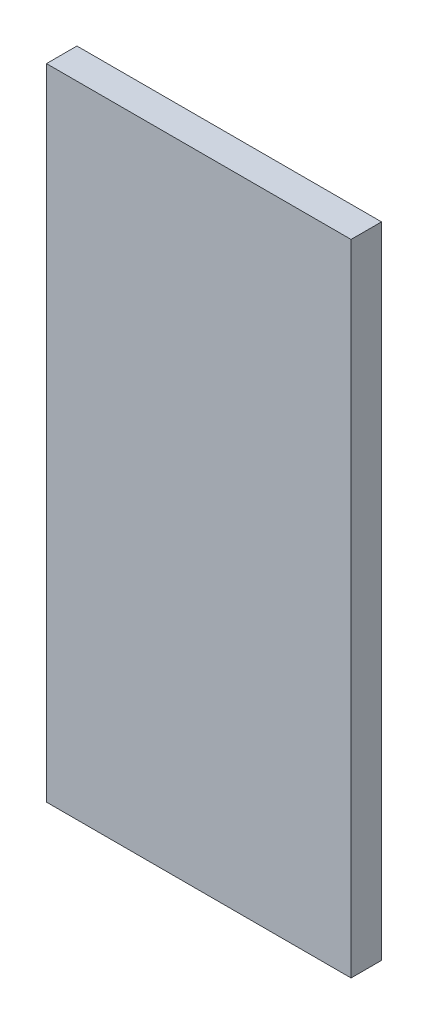
ISO-10303-21;
HEADER;
FILE_DESCRIPTION(('STEP AP214'),'2;1');
FILE_NAME('part.step','',(''),(''),'','','');
FILE_SCHEMA(('AUTOMOTIVE_DESIGN { 1 0 10303 214 1 1 1 1 }'));
ENDSEC;
DATA;
#1=APPLICATION_CONTEXT('core data for automotive mechanical design processes');
#2=APPLICATION_PROTOCOL_DEFINITION('international standard','automotive_design',2000,#1);
#3=PRODUCT_CONTEXT('',#1,'mechanical');
#4=PRODUCT('Part','Part','',(#3));
#5=PRODUCT_RELATED_PRODUCT_CATEGORY('part','',(#4));
#6=PRODUCT_DEFINITION_FORMATION('','',#4);
#7=PRODUCT_DEFINITION_CONTEXT('part definition',#1,'design');
#8=PRODUCT_DEFINITION('design','',#6,#7);
#9=PRODUCT_DEFINITION_SHAPE('','',#8);
#10=(LENGTH_UNIT() NAMED_UNIT(*) SI_UNIT(.MILLI.,.METRE.));
#11=(NAMED_UNIT(*) PLANE_ANGLE_UNIT() SI_UNIT($,.RADIAN.));
#12=(NAMED_UNIT(*) SI_UNIT($,.STERADIAN.) SOLID_ANGLE_UNIT());
#13=UNCERTAINTY_MEASURE_WITH_UNIT(LENGTH_MEASURE(1.E-05),#10,'distance_accuracy_value','');
#14=(GEOMETRIC_REPRESENTATION_CONTEXT(3) GLOBAL_UNCERTAINTY_ASSIGNED_CONTEXT((#13)) GLOBAL_UNIT_ASSIGNED_CONTEXT((#10,
#11,#12)) REPRESENTATION_CONTEXT('',''));
#15=CARTESIAN_POINT('',(0.,0.,0.));
#16=DIRECTION('',(0.,0.,1.));
#17=DIRECTION('',(1.,0.,0.));
#18=AXIS2_PLACEMENT_3D('',#15,#16,#17);
#19=CARTESIAN_POINT('',(0.,0.,10.));
#20=DIRECTION('',(1.,0.,0.));
#21=DIRECTION('',(0.,0.,-1.));
#22=AXIS2_PLACEMENT_3D('',#19,#20,#21);
#23=PLANE('',#22);
#24=DIRECTION('',(0.,-1.,0.));
#25=VECTOR('',#24,1.);
#26=CARTESIAN_POINT('',(0.,0.,0.));
#27=LINE('',#26,#25);
#28=CARTESIAN_POINT('',(0.,210.,0.));
#29=VERTEX_POINT('',#28);
#30=CARTESIAN_POINT('',(0.,0.,0.));
#31=VERTEX_POINT('',#30);
#32=EDGE_CURVE('E99',#29,#31,#27,.T.);
#33=ORIENTED_EDGE('',*,*,#32,.T.);
#34=DIRECTION('',(0.,0.,-1.));
#35=VECTOR('',#34,1.);
#36=CARTESIAN_POINT('',(0.,0.,10.));
#37=LINE('',#36,#35);
#38=CARTESIAN_POINT('',(0.,0.,10.));
#39=VERTEX_POINT('',#38);
#40=EDGE_CURVE('E11',#39,#31,#37,.T.);
#41=ORIENTED_EDGE('',*,*,#40,.F.);
#42=DIRECTION('',(0.,-1.,0.));
#43=VECTOR('',#42,1.);
#44=CARTESIAN_POINT('',(0.,0.,10.));
#45=LINE('',#44,#43);
#46=CARTESIAN_POINT('',(0.,210.,10.));
#47=VERTEX_POINT('',#46);
#48=EDGE_CURVE('E87',#47,#39,#45,.T.);
#49=ORIENTED_EDGE('',*,*,#48,.F.);
#50=DIRECTION('',(0.,0.,-1.));
#51=VECTOR('',#50,1.);
#52=CARTESIAN_POINT('',(0.,210.,10.));
#53=LINE('',#52,#51);
#54=EDGE_CURVE('E95',#47,#29,#53,.T.);
#55=ORIENTED_EDGE('',*,*,#54,.T.);
#56=EDGE_LOOP('',(#33,#41,#49,#55));
#57=FACE_BOUND('',#56,.T.);
#58=ADVANCED_FACE('F36',(#57),#23,.F.);
#59=CARTESIAN_POINT('',(0.,0.,10.));
#60=DIRECTION('',(0.,1.,0.));
#61=DIRECTION('',(0.,0.,1.));
#62=AXIS2_PLACEMENT_3D('',#59,#60,#61);
#63=PLANE('',#62);
#64=DIRECTION('',(1.,0.,0.));
#65=VECTOR('',#64,1.);
#66=CARTESIAN_POINT('',(0.,0.,0.));
#67=LINE('',#66,#65);
#68=CARTESIAN_POINT('',(100.,0.,0.));
#69=VERTEX_POINT('',#68);
#70=EDGE_CURVE('E91',#31,#69,#67,.T.);
#71=ORIENTED_EDGE('',*,*,#70,.T.);
#72=DIRECTION('',(0.,0.,-1.));
#73=VECTOR('',#72,1.);
#74=CARTESIAN_POINT('',(100.,0.,10.));
#75=LINE('',#74,#73);
#76=CARTESIAN_POINT('',(100.,0.,10.));
#77=VERTEX_POINT('',#76);
#78=EDGE_CURVE('E44',#77,#69,#75,.T.);
#79=ORIENTED_EDGE('',*,*,#78,.F.);
#80=DIRECTION('',(1.,0.,0.));
#81=VECTOR('',#80,1.);
#82=CARTESIAN_POINT('',(0.,0.,10.));
#83=LINE('',#82,#81);
#84=EDGE_CURVE('E82',#39,#77,#83,.T.);
#85=ORIENTED_EDGE('',*,*,#84,.F.);
#86=ORIENTED_EDGE('',*,*,#40,.T.);
#87=EDGE_LOOP('',(#71,#79,#85,#86));
#88=FACE_BOUND('',#87,.T.);
#89=ADVANCED_FACE('F90',(#88),#63,.F.);
#90=CARTESIAN_POINT('',(100.,0.,10.));
#91=DIRECTION('',(-1.,0.,0.));
#92=DIRECTION('',(0.,0.,1.));
#93=AXIS2_PLACEMENT_3D('',#90,#91,#92);
#94=PLANE('',#93);
#95=DIRECTION('',(0.,1.,0.));
#96=VECTOR('',#95,1.);
#97=CARTESIAN_POINT('',(100.,0.,0.));
#98=LINE('',#97,#96);
#99=CARTESIAN_POINT('',(100.,210.,0.));
#100=VERTEX_POINT('',#99);
#101=EDGE_CURVE('E69',#69,#100,#98,.T.);
#102=ORIENTED_EDGE('',*,*,#101,.T.);
#103=DIRECTION('',(0.,0.,-1.));
#104=VECTOR('',#103,1.);
#105=CARTESIAN_POINT('',(100.,210.,10.));
#106=LINE('',#105,#104);
#107=CARTESIAN_POINT('',(100.,210.,10.));
#108=VERTEX_POINT('',#107);
#109=EDGE_CURVE('E92',#108,#100,#106,.T.);
#110=ORIENTED_EDGE('',*,*,#109,.F.);
#111=DIRECTION('',(0.,1.,0.));
#112=VECTOR('',#111,1.);
#113=CARTESIAN_POINT('',(100.,0.,10.));
#114=LINE('',#113,#112);
#115=EDGE_CURVE('E85',#77,#108,#114,.T.);
#116=ORIENTED_EDGE('',*,*,#115,.F.);
#117=ORIENTED_EDGE('',*,*,#78,.T.);
#118=EDGE_LOOP('',(#102,#110,#116,#117));
#119=FACE_BOUND('',#118,.T.);
#120=ADVANCED_FACE('F93',(#119),#94,.F.);
#121=CARTESIAN_POINT('',(0.,210.,10.));
#122=DIRECTION('',(0.,-1.,0.));
#123=DIRECTION('',(0.,0.,-1.));
#124=AXIS2_PLACEMENT_3D('',#121,#122,#123);
#125=PLANE('',#124);
#126=DIRECTION('',(-1.,0.,0.));
#127=VECTOR('',#126,1.);
#128=CARTESIAN_POINT('',(0.,210.,0.));
#129=LINE('',#128,#127);
#130=EDGE_CURVE('E75',#100,#29,#129,.T.);
#131=ORIENTED_EDGE('',*,*,#130,.T.);
#132=ORIENTED_EDGE('',*,*,#54,.F.);
#133=DIRECTION('',(-1.,0.,0.));
#134=VECTOR('',#133,1.);
#135=CARTESIAN_POINT('',(0.,210.,10.));
#136=LINE('',#135,#134);
#137=EDGE_CURVE('E52',#108,#47,#136,.T.);
#138=ORIENTED_EDGE('',*,*,#137,.F.);
#139=ORIENTED_EDGE('',*,*,#109,.T.);
#140=EDGE_LOOP('',(#131,#132,#138,#139));
#141=FACE_BOUND('',#140,.T.);
#142=ADVANCED_FACE('F106',(#141),#125,.F.);
#143=CARTESIAN_POINT('',(0.,0.,10.));
#144=DIRECTION('',(0.,0.,-1.));
#145=DIRECTION('',(-1.,0.,0.));
#146=AXIS2_PLACEMENT_3D('',#143,#144,#145);
#147=PLANE('',#146);
#148=ORIENTED_EDGE('',*,*,#48,.T.);
#149=ORIENTED_EDGE('',*,*,#84,.T.);
#150=ORIENTED_EDGE('',*,*,#115,.T.);
#151=ORIENTED_EDGE('',*,*,#137,.T.);
#152=EDGE_LOOP('',(#148,#149,#150,#151));
#153=FACE_BOUND('',#152,.T.);
#154=ADVANCED_FACE('F83',(#153),#147,.F.);
#155=CARTESIAN_POINT('',(0.,0.,0.));
#156=DIRECTION('',(0.,0.,-1.));
#157=DIRECTION('',(-1.,0.,0.));
#158=AXIS2_PLACEMENT_3D('',#155,#156,#157);
#159=PLANE('',#158);
#160=ORIENTED_EDGE('',*,*,#32,.F.);
#161=ORIENTED_EDGE('',*,*,#130,.F.);
#162=ORIENTED_EDGE('',*,*,#101,.F.);
#163=ORIENTED_EDGE('',*,*,#70,.F.);
#164=EDGE_LOOP('',(#160,#161,#162,#163));
#165=FACE_BOUND('',#164,.T.);
#166=ADVANCED_FACE('F109',(#165),#159,.T.);
#167=CLOSED_SHELL('',(#58,#89,#120,#142,#154,#166));
#168=MANIFOLD_SOLID_BREP('B2',#167);
#169=ADVANCED_BREP_SHAPE_REPRESENTATION('',(#18,#168),#14);
#170=SHAPE_DEFINITION_REPRESENTATION(#9,#169);
ENDSEC;
END-ISO-10303-21;
